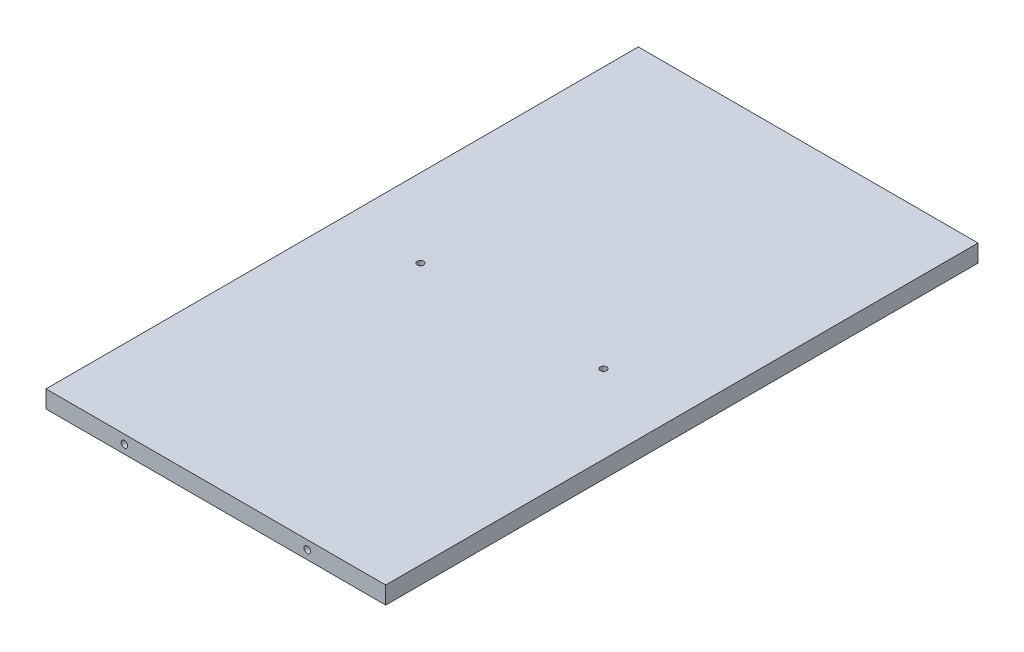
ISO-10303-21;
HEADER;
FILE_DESCRIPTION(('STEP AP214'),'2;1');
FILE_NAME('part.step','',(''),(''),'','','');
FILE_SCHEMA(('AUTOMOTIVE_DESIGN { 1 0 10303 214 1 1 1 1 }'));
ENDSEC;
DATA;
#1=APPLICATION_CONTEXT('core data for automotive mechanical design processes');
#2=APPLICATION_PROTOCOL_DEFINITION('international standard','automotive_design',2000,#1);
#3=PRODUCT_CONTEXT('',#1,'mechanical');
#4=PRODUCT('Part','Part','',(#3));
#5=PRODUCT_RELATED_PRODUCT_CATEGORY('part','',(#4));
#6=PRODUCT_DEFINITION_FORMATION('','',#4);
#7=PRODUCT_DEFINITION_CONTEXT('part definition',#1,'design');
#8=PRODUCT_DEFINITION('design','',#6,#7);
#9=PRODUCT_DEFINITION_SHAPE('','',#8);
#10=(LENGTH_UNIT() NAMED_UNIT(*) SI_UNIT(.MILLI.,.METRE.));
#11=(NAMED_UNIT(*) PLANE_ANGLE_UNIT() SI_UNIT($,.RADIAN.));
#12=(NAMED_UNIT(*) SI_UNIT($,.STERADIAN.) SOLID_ANGLE_UNIT());
#13=UNCERTAINTY_MEASURE_WITH_UNIT(LENGTH_MEASURE(1.E-05),#10,'distance_accuracy_value','');
#14=(GEOMETRIC_REPRESENTATION_CONTEXT(3) GLOBAL_UNCERTAINTY_ASSIGNED_CONTEXT((#13)) GLOBAL_UNIT_ASSIGNED_CONTEXT((#10,
#11,#12)) REPRESENTATION_CONTEXT('',''));
#15=CARTESIAN_POINT('',(0.,0.,0.));
#16=DIRECTION('',(0.,0.,1.));
#17=DIRECTION('',(1.,0.,0.));
#18=AXIS2_PLACEMENT_3D('',#15,#16,#17);
#19=CARTESIAN_POINT('',(195.,-10.,680.));
#20=DIRECTION('',(-1.,0.,0.));
#21=DIRECTION('',(0.,0.,1.));
#22=AXIS2_PLACEMENT_3D('',#19,#20,#21);
#23=PLANE('',#22);
#24=DIRECTION('',(0.,1.,0.));
#25=VECTOR('',#24,1.);
#26=CARTESIAN_POINT('',(195.,-10.,0.));
#27=LINE('',#26,#25);
#28=CARTESIAN_POINT('',(195.,-10.,0.));
#29=VERTEX_POINT('',#28);
#30=CARTESIAN_POINT('',(195.,10.,0.));
#31=VERTEX_POINT('',#30);
#32=EDGE_CURVE('E107',#29,#31,#27,.T.);
#33=ORIENTED_EDGE('',*,*,#32,.T.);
#34=DIRECTION('',(0.,0.,-1.));
#35=VECTOR('',#34,1.);
#36=CARTESIAN_POINT('',(195.,10.,680.));
#37=LINE('',#36,#35);
#38=CARTESIAN_POINT('',(195.,10.,680.));
#39=VERTEX_POINT('',#38);
#40=EDGE_CURVE('E11',#39,#31,#37,.T.);
#41=ORIENTED_EDGE('',*,*,#40,.F.);
#42=DIRECTION('',(0.,1.,0.));
#43=VECTOR('',#42,1.);
#44=CARTESIAN_POINT('',(195.,-10.,680.));
#45=LINE('',#44,#43);
#46=CARTESIAN_POINT('',(195.,-10.,680.));
#47=VERTEX_POINT('',#46);
#48=EDGE_CURVE('E98',#47,#39,#45,.T.);
#49=ORIENTED_EDGE('',*,*,#48,.F.);
#50=DIRECTION('',(0.,0.,-1.));
#51=VECTOR('',#50,1.);
#52=CARTESIAN_POINT('',(195.,-10.,680.));
#53=LINE('',#52,#51);
#54=EDGE_CURVE('E102',#47,#29,#53,.T.);
#55=ORIENTED_EDGE('',*,*,#54,.T.);
#56=EDGE_LOOP('',(#33,#41,#49,#55));
#57=FACE_BOUND('',#56,.T.);
#58=ADVANCED_FACE('F43',(#57),#23,.F.);
#59=CARTESIAN_POINT('',(-195.,10.,680.));
#60=DIRECTION('',(0.,-1.,0.));
#61=DIRECTION('',(0.,0.,-1.));
#62=AXIS2_PLACEMENT_3D('',#59,#60,#61);
#63=PLANE('',#62);
#64=CARTESIAN_POINT('',(105.,10.,340.));
#65=DIRECTION('',(0.,1.,0.));
#66=DIRECTION('',(0.,0.,1.));
#67=AXIS2_PLACEMENT_3D('',#64,#65,#66);
#68=CIRCLE('',#67,3.75000000000001);
#69=CARTESIAN_POINT('',(105.,10.,343.75));
#70=VERTEX_POINT('',#69);
#71=EDGE_CURVE('E123',#70,#70,#68,.T.);
#72=ORIENTED_EDGE('',*,*,#71,.F.);
#73=EDGE_LOOP('',(#72));
#74=FACE_BOUND('',#73,.T.);
#75=CARTESIAN_POINT('',(-105.,10.,340.));
#76=DIRECTION('',(0.,1.,0.));
#77=DIRECTION('',(0.,0.,1.));
#78=AXIS2_PLACEMENT_3D('',#75,#76,#77);
#79=CIRCLE('',#78,3.75000000000001);
#80=CARTESIAN_POINT('',(-105.,10.,343.75));
#81=VERTEX_POINT('',#80);
#82=EDGE_CURVE('E134',#81,#81,#79,.T.);
#83=ORIENTED_EDGE('',*,*,#82,.F.);
#84=EDGE_LOOP('',(#83));
#85=FACE_BOUND('',#84,.T.);
#86=DIRECTION('',(-1.,0.,0.));
#87=VECTOR('',#86,1.);
#88=CARTESIAN_POINT('',(-195.,10.,0.));
#89=LINE('',#88,#87);
#90=CARTESIAN_POINT('',(-195.,10.,0.));
#91=VERTEX_POINT('',#90);
#92=EDGE_CURVE('E99',#31,#91,#89,.T.);
#93=ORIENTED_EDGE('',*,*,#92,.T.);
#94=DIRECTION('',(0.,0.,-1.));
#95=VECTOR('',#94,1.);
#96=CARTESIAN_POINT('',(-195.,10.,680.));
#97=LINE('',#96,#95);
#98=CARTESIAN_POINT('',(-195.,10.,680.));
#99=VERTEX_POINT('',#98);
#100=EDGE_CURVE('E55',#99,#91,#97,.T.);
#101=ORIENTED_EDGE('',*,*,#100,.F.);
#102=DIRECTION('',(-1.,0.,0.));
#103=VECTOR('',#102,1.);
#104=CARTESIAN_POINT('',(-195.,10.,680.));
#105=LINE('',#104,#103);
#106=EDGE_CURVE('E92',#39,#99,#105,.T.);
#107=ORIENTED_EDGE('',*,*,#106,.F.);
#108=ORIENTED_EDGE('',*,*,#40,.T.);
#109=EDGE_LOOP('',(#93,#101,#107,#108));
#110=FACE_BOUND('',#109,.T.);
#111=ADVANCED_FACE('F100',(#74,#85,#110),#63,.F.);
#112=CARTESIAN_POINT('',(-195.,-10.,680.));
#113=DIRECTION('',(1.,0.,0.));
#114=DIRECTION('',(0.,0.,-1.));
#115=AXIS2_PLACEMENT_3D('',#112,#113,#114);
#116=PLANE('',#115);
#117=DIRECTION('',(0.,-1.,0.));
#118=VECTOR('',#117,1.);
#119=CARTESIAN_POINT('',(-195.,-10.,0.));
#120=LINE('',#119,#118);
#121=CARTESIAN_POINT('',(-195.,-10.,0.));
#122=VERTEX_POINT('',#121);
#123=EDGE_CURVE('E76',#91,#122,#120,.T.);
#124=ORIENTED_EDGE('',*,*,#123,.T.);
#125=DIRECTION('',(0.,0.,-1.));
#126=VECTOR('',#125,1.);
#127=CARTESIAN_POINT('',(-195.,-10.,680.));
#128=LINE('',#127,#126);
#129=CARTESIAN_POINT('',(-195.,-10.,680.));
#130=VERTEX_POINT('',#129);
#131=EDGE_CURVE('E103',#130,#122,#128,.T.);
#132=ORIENTED_EDGE('',*,*,#131,.F.);
#133=DIRECTION('',(0.,-1.,0.));
#134=VECTOR('',#133,1.);
#135=CARTESIAN_POINT('',(-195.,-10.,680.));
#136=LINE('',#135,#134);
#137=EDGE_CURVE('E91',#99,#130,#136,.T.);
#138=ORIENTED_EDGE('',*,*,#137,.F.);
#139=ORIENTED_EDGE('',*,*,#100,.T.);
#140=EDGE_LOOP('',(#124,#132,#138,#139));
#141=FACE_BOUND('',#140,.T.);
#142=ADVANCED_FACE('F101',(#141),#116,.F.);
#143=CARTESIAN_POINT('',(-195.,-10.,680.));
#144=DIRECTION('',(0.,1.,0.));
#145=DIRECTION('',(0.,0.,1.));
#146=AXIS2_PLACEMENT_3D('',#143,#144,#145);
#147=PLANE('',#146);
#148=CARTESIAN_POINT('',(105.,-10.,340.));
#149=DIRECTION('',(0.,1.,0.));
#150=DIRECTION('',(0.,0.,1.));
#151=AXIS2_PLACEMENT_3D('',#148,#149,#150);
#152=CIRCLE('',#151,3.75000000000001);
#153=CARTESIAN_POINT('',(105.,-10.,343.75));
#154=VERTEX_POINT('',#153);
#155=EDGE_CURVE('E46',#154,#154,#152,.T.);
#156=ORIENTED_EDGE('',*,*,#155,.T.);
#157=EDGE_LOOP('',(#156));
#158=FACE_BOUND('',#157,.T.);
#159=CARTESIAN_POINT('',(-105.,-10.,340.));
#160=DIRECTION('',(0.,1.,0.));
#161=DIRECTION('',(0.,0.,1.));
#162=AXIS2_PLACEMENT_3D('',#159,#160,#161);
#163=CIRCLE('',#162,3.75000000000001);
#164=CARTESIAN_POINT('',(-105.,-10.,343.75));
#165=VERTEX_POINT('',#164);
#166=EDGE_CURVE('E124',#165,#165,#163,.T.);
#167=ORIENTED_EDGE('',*,*,#166,.T.);
#168=EDGE_LOOP('',(#167));
#169=FACE_BOUND('',#168,.T.);
#170=DIRECTION('',(1.,0.,0.));
#171=VECTOR('',#170,1.);
#172=CARTESIAN_POINT('',(-195.,-10.,0.));
#173=LINE('',#172,#171);
#174=EDGE_CURVE('E81',#122,#29,#173,.T.);
#175=ORIENTED_EDGE('',*,*,#174,.T.);
#176=ORIENTED_EDGE('',*,*,#54,.F.);
#177=DIRECTION('',(1.,0.,0.));
#178=VECTOR('',#177,1.);
#179=CARTESIAN_POINT('',(-195.,-10.,680.));
#180=LINE('',#179,#178);
#181=EDGE_CURVE('E62',#130,#47,#180,.T.);
#182=ORIENTED_EDGE('',*,*,#181,.F.);
#183=ORIENTED_EDGE('',*,*,#131,.T.);
#184=EDGE_LOOP('',(#175,#176,#182,#183));
#185=FACE_BOUND('',#184,.T.);
#186=ADVANCED_FACE('F164',(#158,#169,#185),#147,.F.);
#187=CARTESIAN_POINT('',(0.,0.,680.));
#188=DIRECTION('',(0.,0.,-1.));
#189=DIRECTION('',(-1.,0.,0.));
#190=AXIS2_PLACEMENT_3D('',#187,#188,#189);
#191=PLANE('',#190);
#192=CARTESIAN_POINT('',(-105.,0.,680.));
#193=DIRECTION('',(0.,0.,-1.));
#194=DIRECTION('',(-1.,0.,0.));
#195=AXIS2_PLACEMENT_3D('',#192,#193,#194);
#196=CIRCLE('',#195,3.75000000000001);
#197=CARTESIAN_POINT('',(-108.75,0.,680.));
#198=VERTEX_POINT('',#197);
#199=EDGE_CURVE('E115',#198,#198,#196,.F.);
#200=ORIENTED_EDGE('',*,*,#199,.F.);
#201=EDGE_LOOP('',(#200));
#202=FACE_BOUND('',#201,.T.);
#203=CARTESIAN_POINT('',(105.,0.,680.));
#204=DIRECTION('',(0.,0.,-1.));
#205=DIRECTION('',(-1.,0.,0.));
#206=AXIS2_PLACEMENT_3D('',#203,#204,#205);
#207=CIRCLE('',#206,3.75000000000001);
#208=CARTESIAN_POINT('',(101.25,0.,680.));
#209=VERTEX_POINT('',#208);
#210=EDGE_CURVE('E117',#209,#209,#207,.F.);
#211=ORIENTED_EDGE('',*,*,#210,.F.);
#212=EDGE_LOOP('',(#211));
#213=FACE_BOUND('',#212,.T.);
#214=ORIENTED_EDGE('',*,*,#48,.T.);
#215=ORIENTED_EDGE('',*,*,#106,.T.);
#216=ORIENTED_EDGE('',*,*,#137,.T.);
#217=ORIENTED_EDGE('',*,*,#181,.T.);
#218=EDGE_LOOP('',(#214,#215,#216,#217));
#219=FACE_BOUND('',#218,.T.);
#220=ADVANCED_FACE('F95',(#202,#213,#219),#191,.F.);
#221=CARTESIAN_POINT('',(0.,0.,0.));
#222=DIRECTION('',(0.,0.,-1.));
#223=DIRECTION('',(-1.,0.,0.));
#224=AXIS2_PLACEMENT_3D('',#221,#222,#223);
#225=PLANE('',#224);
#226=CARTESIAN_POINT('',(105.,0.,0.));
#227=DIRECTION('',(0.,0.,-1.));
#228=DIRECTION('',(-1.,0.,0.));
#229=AXIS2_PLACEMENT_3D('',#226,#227,#228);
#230=CIRCLE('',#229,3.75000000000001);
#231=CARTESIAN_POINT('',(101.25,0.,0.));
#232=VERTEX_POINT('',#231);
#233=EDGE_CURVE('E145',#232,#232,#230,.T.);
#234=ORIENTED_EDGE('',*,*,#233,.F.);
#235=EDGE_LOOP('',(#234));
#236=FACE_BOUND('',#235,.T.);
#237=CARTESIAN_POINT('',(-105.,0.,0.));
#238=DIRECTION('',(0.,0.,-1.));
#239=DIRECTION('',(-1.,0.,0.));
#240=AXIS2_PLACEMENT_3D('',#237,#238,#239);
#241=CIRCLE('',#240,3.75000000000001);
#242=CARTESIAN_POINT('',(-108.75,0.,0.));
#243=VERTEX_POINT('',#242);
#244=EDGE_CURVE('E143',#243,#243,#241,.T.);
#245=ORIENTED_EDGE('',*,*,#244,.F.);
#246=EDGE_LOOP('',(#245));
#247=FACE_BOUND('',#246,.T.);
#248=ORIENTED_EDGE('',*,*,#32,.F.);
#249=ORIENTED_EDGE('',*,*,#174,.F.);
#250=ORIENTED_EDGE('',*,*,#123,.F.);
#251=ORIENTED_EDGE('',*,*,#92,.F.);
#252=EDGE_LOOP('',(#248,#249,#250,#251));
#253=FACE_BOUND('',#252,.T.);
#254=ADVANCED_FACE('F158',(#236,#247,#253),#225,.T.);
#255=CARTESIAN_POINT('',(105.,0.,691.));
#256=DIRECTION('',(0.,0.,-1.));
#257=DIRECTION('',(-1.,0.,0.));
#258=AXIS2_PLACEMENT_3D('',#255,#256,#257);
#259=CYLINDRICAL_SURFACE('',#258,3.75000000000001);
#260=CARTESIAN_POINT('',(105.,0.,660.));
#261=DIRECTION('',(0.,0.,1.));
#262=DIRECTION('',(1.,0.,0.));
#263=AXIS2_PLACEMENT_3D('',#260,#261,#262);
#264=CIRCLE('',#263,3.75000000000001);
#265=CARTESIAN_POINT('',(108.75,0.,660.));
#266=VERTEX_POINT('',#265);
#267=EDGE_CURVE('E142',#266,#266,#264,.T.);
#268=ORIENTED_EDGE('',*,*,#267,.F.);
#269=EDGE_LOOP('',(#268));
#270=FACE_BOUND('',#269,.T.);
#271=ORIENTED_EDGE('',*,*,#210,.T.);
#272=EDGE_LOOP('',(#271));
#273=FACE_BOUND('',#272,.T.);
#274=ADVANCED_FACE('F160',(#270,#273),#259,.F.);
#275=CARTESIAN_POINT('',(105.,0.,660.));
#276=DIRECTION('',(0.,0.,1.));
#277=DIRECTION('',(1.,0.,0.));
#278=AXIS2_PLACEMENT_3D('',#275,#276,#277);
#279=PLANE('',#278);
#280=ORIENTED_EDGE('',*,*,#267,.T.);
#281=EDGE_LOOP('',(#280));
#282=FACE_BOUND('',#281,.T.);
#283=ADVANCED_FACE('F152',(#282),#279,.T.);
#284=CARTESIAN_POINT('',(-105.,0.,691.));
#285=DIRECTION('',(0.,0.,-1.));
#286=DIRECTION('',(-1.,0.,0.));
#287=AXIS2_PLACEMENT_3D('',#284,#285,#286);
#288=CYLINDRICAL_SURFACE('',#287,3.75000000000001);
#289=CARTESIAN_POINT('',(-105.,0.,660.));
#290=DIRECTION('',(0.,0.,1.));
#291=DIRECTION('',(1.,0.,0.));
#292=AXIS2_PLACEMENT_3D('',#289,#290,#291);
#293=CIRCLE('',#292,3.75000000000001);
#294=CARTESIAN_POINT('',(-101.25,0.,660.));
#295=VERTEX_POINT('',#294);
#296=EDGE_CURVE('E122',#295,#295,#293,.T.);
#297=ORIENTED_EDGE('',*,*,#296,.F.);
#298=EDGE_LOOP('',(#297));
#299=FACE_BOUND('',#298,.T.);
#300=ORIENTED_EDGE('',*,*,#199,.T.);
#301=EDGE_LOOP('',(#300));
#302=FACE_BOUND('',#301,.T.);
#303=ADVANCED_FACE('F225',(#299,#302),#288,.F.);
#304=CARTESIAN_POINT('',(-105.,0.,660.));
#305=DIRECTION('',(0.,0.,1.));
#306=DIRECTION('',(1.,0.,0.));
#307=AXIS2_PLACEMENT_3D('',#304,#305,#306);
#308=PLANE('',#307);
#309=ORIENTED_EDGE('',*,*,#296,.T.);
#310=EDGE_LOOP('',(#309));
#311=FACE_BOUND('',#310,.T.);
#312=ADVANCED_FACE('F213',(#311),#308,.T.);
#313=CARTESIAN_POINT('',(-105.,0.,20.));
#314=DIRECTION('',(0.,0.,-1.));
#315=DIRECTION('',(-1.,0.,0.));
#316=AXIS2_PLACEMENT_3D('',#313,#314,#315);
#317=CYLINDRICAL_SURFACE('',#316,3.75000000000001);
#318=CARTESIAN_POINT('',(-105.,0.,20.));
#319=DIRECTION('',(0.,0.,-1.));
#320=DIRECTION('',(-1.,0.,0.));
#321=AXIS2_PLACEMENT_3D('',#318,#319,#320);
#322=CIRCLE('',#321,3.75000000000001);
#323=CARTESIAN_POINT('',(-108.75,0.,20.));
#324=VERTEX_POINT('',#323);
#325=EDGE_CURVE('E126',#324,#324,#322,.T.);
#326=ORIENTED_EDGE('',*,*,#325,.F.);
#327=EDGE_LOOP('',(#326));
#328=FACE_BOUND('',#327,.T.);
#329=ORIENTED_EDGE('',*,*,#244,.T.);
#330=EDGE_LOOP('',(#329));
#331=FACE_BOUND('',#330,.T.);
#332=ADVANCED_FACE('F215',(#328,#331),#317,.F.);
#333=CARTESIAN_POINT('',(-105.,0.,20.));
#334=DIRECTION('',(0.,0.,-1.));
#335=DIRECTION('',(-1.,0.,0.));
#336=AXIS2_PLACEMENT_3D('',#333,#334,#335);
#337=PLANE('',#336);
#338=ORIENTED_EDGE('',*,*,#325,.T.);
#339=EDGE_LOOP('',(#338));
#340=FACE_BOUND('',#339,.T.);
#341=ADVANCED_FACE('F208',(#340),#337,.T.);
#342=CARTESIAN_POINT('',(105.,0.,20.));
#343=DIRECTION('',(0.,0.,-1.));
#344=DIRECTION('',(-1.,0.,0.));
#345=AXIS2_PLACEMENT_3D('',#342,#343,#344);
#346=CYLINDRICAL_SURFACE('',#345,3.75000000000001);
#347=CARTESIAN_POINT('',(105.,0.,20.));
#348=DIRECTION('',(0.,0.,-1.));
#349=DIRECTION('',(-1.,0.,0.));
#350=AXIS2_PLACEMENT_3D('',#347,#348,#349);
#351=CIRCLE('',#350,3.75000000000001);
#352=CARTESIAN_POINT('',(101.25,0.,20.));
#353=VERTEX_POINT('',#352);
#354=EDGE_CURVE('E139',#353,#353,#351,.T.);
#355=ORIENTED_EDGE('',*,*,#354,.F.);
#356=EDGE_LOOP('',(#355));
#357=FACE_BOUND('',#356,.T.);
#358=ORIENTED_EDGE('',*,*,#233,.T.);
#359=EDGE_LOOP('',(#358));
#360=FACE_BOUND('',#359,.T.);
#361=ADVANCED_FACE('F201',(#357,#360),#346,.F.);
#362=CARTESIAN_POINT('',(105.,0.,20.));
#363=DIRECTION('',(0.,0.,-1.));
#364=DIRECTION('',(-1.,0.,0.));
#365=AXIS2_PLACEMENT_3D('',#362,#363,#364);
#366=PLANE('',#365);
#367=ORIENTED_EDGE('',*,*,#354,.T.);
#368=EDGE_LOOP('',(#367));
#369=FACE_BOUND('',#368,.T.);
#370=ADVANCED_FACE('F200',(#369),#366,.T.);
#371=CARTESIAN_POINT('',(-105.,-24.9999999999996,340.));
#372=DIRECTION('',(0.,1.,0.));
#373=DIRECTION('',(0.,0.,1.));
#374=AXIS2_PLACEMENT_3D('',#371,#372,#373);
#375=CYLINDRICAL_SURFACE('',#374,3.75000000000001);
#376=ORIENTED_EDGE('',*,*,#82,.T.);
#377=EDGE_LOOP('',(#376));
#378=FACE_BOUND('',#377,.T.);
#379=ORIENTED_EDGE('',*,*,#166,.F.);
#380=EDGE_LOOP('',(#379));
#381=FACE_BOUND('',#380,.T.);
#382=ADVANCED_FACE('F191',(#378,#381),#375,.F.);
#383=CARTESIAN_POINT('',(105.,-24.9999999999996,340.));
#384=DIRECTION('',(0.,1.,0.));
#385=DIRECTION('',(0.,0.,1.));
#386=AXIS2_PLACEMENT_3D('',#383,#384,#385);
#387=CYLINDRICAL_SURFACE('',#386,3.75000000000001);
#388=ORIENTED_EDGE('',*,*,#71,.T.);
#389=EDGE_LOOP('',(#388));
#390=FACE_BOUND('',#389,.T.);
#391=ORIENTED_EDGE('',*,*,#155,.F.);
#392=EDGE_LOOP('',(#391));
#393=FACE_BOUND('',#392,.T.);
#394=ADVANCED_FACE('F196',(#390,#393),#387,.F.);
#395=CLOSED_SHELL('',(#58,#111,#142,#186,#220,#254,#274,#283,#303,#312,#332,#341,#361,#370,#382,#394));
#396=MANIFOLD_SOLID_BREP('B2',#395);
#397=ADVANCED_BREP_SHAPE_REPRESENTATION('',(#18,#396),#14);
#398=SHAPE_DEFINITION_REPRESENTATION(#9,#397);
ENDSEC;
END-ISO-10303-21;
